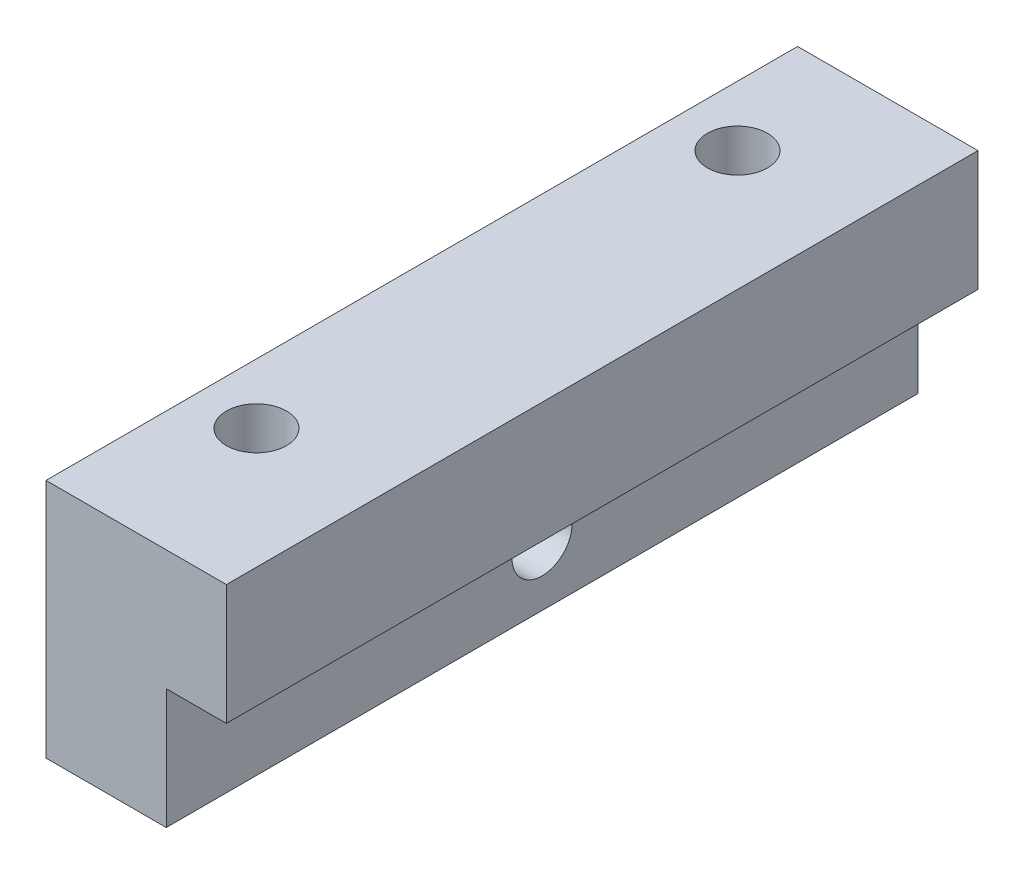
ISO-10303-21;
HEADER;
FILE_DESCRIPTION(('STEP AP214'),'2;1');
FILE_NAME('part.step','',(''),(''),'','','');
FILE_SCHEMA(('AUTOMOTIVE_DESIGN { 1 0 10303 214 1 1 1 1 }'));
ENDSEC;
DATA;
#1=APPLICATION_CONTEXT('core data for automotive mechanical design processes');
#2=APPLICATION_PROTOCOL_DEFINITION('international standard','automotive_design',2000,#1);
#3=PRODUCT_CONTEXT('',#1,'mechanical');
#4=PRODUCT('Part','Part','',(#3));
#5=PRODUCT_RELATED_PRODUCT_CATEGORY('part','',(#4));
#6=PRODUCT_DEFINITION_FORMATION('','',#4);
#7=PRODUCT_DEFINITION_CONTEXT('part definition',#1,'design');
#8=PRODUCT_DEFINITION('design','',#6,#7);
#9=PRODUCT_DEFINITION_SHAPE('','',#8);
#10=(LENGTH_UNIT() NAMED_UNIT(*) SI_UNIT(.MILLI.,.METRE.));
#11=(NAMED_UNIT(*) PLANE_ANGLE_UNIT() SI_UNIT($,.RADIAN.));
#12=(NAMED_UNIT(*) SI_UNIT($,.STERADIAN.) SOLID_ANGLE_UNIT());
#13=UNCERTAINTY_MEASURE_WITH_UNIT(LENGTH_MEASURE(1.E-05),#10,'distance_accuracy_value','');
#14=(GEOMETRIC_REPRESENTATION_CONTEXT(3) GLOBAL_UNCERTAINTY_ASSIGNED_CONTEXT((#13)) GLOBAL_UNIT_ASSIGNED_CONTEXT((#10,
#11,#12)) REPRESENTATION_CONTEXT('',''));
#15=CARTESIAN_POINT('',(0.,0.,0.));
#16=DIRECTION('',(0.,0.,1.));
#17=DIRECTION('',(1.,0.,0.));
#18=AXIS2_PLACEMENT_3D('',#15,#16,#17);
#19=CARTESIAN_POINT('',(8.,0.,25.));
#20=DIRECTION('',(0.,1.,0.));
#21=DIRECTION('',(-1.,0.,0.));
#22=AXIS2_PLACEMENT_3D('',#19,#20,#21);
#23=PLANE('',#22);
#24=CARTESIAN_POINT('',(4.,0.,-17.));
#25=DIRECTION('',(0.,1.,0.));
#26=DIRECTION('',(-1.,0.,0.));
#27=AXIS2_PLACEMENT_3D('',#24,#25,#26);
#28=CIRCLE('',#27,2.);
#29=CARTESIAN_POINT('',(2.,0.,-17.));
#30=VERTEX_POINT('',#29);
#31=EDGE_CURVE('E185',#30,#30,#28,.T.);
#32=ORIENTED_EDGE('',*,*,#31,.T.);
#33=EDGE_LOOP('',(#32));
#34=FACE_BOUND('',#33,.T.);
#35=CARTESIAN_POINT('',(4.00000000000001,0.,15.));
#36=DIRECTION('',(0.,1.,0.));
#37=DIRECTION('',(-1.,0.,0.));
#38=AXIS2_PLACEMENT_3D('',#35,#36,#37);
#39=CIRCLE('',#38,2.);
#40=CARTESIAN_POINT('',(2.,0.,15.));
#41=VERTEX_POINT('',#40);
#42=EDGE_CURVE('E188',#41,#41,#39,.T.);
#43=ORIENTED_EDGE('',*,*,#42,.T.);
#44=EDGE_LOOP('',(#43));
#45=FACE_BOUND('',#44,.T.);
#46=DIRECTION('',(1.,0.,0.));
#47=VECTOR('',#46,1.);
#48=CARTESIAN_POINT('',(8.,0.,-25.));
#49=LINE('',#48,#47);
#50=CARTESIAN_POINT('',(0.,0.,-25.));
#51=VERTEX_POINT('',#50);
#52=CARTESIAN_POINT('',(8.,0.,-25.));
#53=VERTEX_POINT('',#52);
#54=EDGE_CURVE('E128',#51,#53,#49,.T.);
#55=ORIENTED_EDGE('',*,*,#54,.T.);
#56=DIRECTION('',(0.,0.,-1.));
#57=VECTOR('',#56,1.);
#58=CARTESIAN_POINT('',(8.,0.,25.));
#59=LINE('',#58,#57);
#60=CARTESIAN_POINT('',(8.,0.,25.));
#61=VERTEX_POINT('',#60);
#62=EDGE_CURVE('E11',#61,#53,#59,.T.);
#63=ORIENTED_EDGE('',*,*,#62,.F.);
#64=DIRECTION('',(1.,0.,0.));
#65=VECTOR('',#64,1.);
#66=CARTESIAN_POINT('',(8.,0.,25.));
#67=LINE('',#66,#65);
#68=CARTESIAN_POINT('',(0.,0.,25.));
#69=VERTEX_POINT('',#68);
#70=EDGE_CURVE('E145',#69,#61,#67,.T.);
#71=ORIENTED_EDGE('',*,*,#70,.F.);
#72=DIRECTION('',(0.,0.,-1.));
#73=VECTOR('',#72,1.);
#74=CARTESIAN_POINT('',(0.,0.,25.));
#75=LINE('',#74,#73);
#76=EDGE_CURVE('E124',#69,#51,#75,.T.);
#77=ORIENTED_EDGE('',*,*,#76,.T.);
#78=EDGE_LOOP('',(#55,#63,#71,#77));
#79=FACE_BOUND('',#78,.T.);
#80=ADVANCED_FACE('F39',(#34,#45,#79),#23,.F.);
#81=CARTESIAN_POINT('',(8.,8.,25.));
#82=DIRECTION('',(-1.,0.,0.));
#83=DIRECTION('',(0.,-1.,0.));
#84=AXIS2_PLACEMENT_3D('',#81,#82,#83);
#85=PLANE('',#84);
#86=CARTESIAN_POINT('',(8.,4.,0.));
#87=DIRECTION('',(-1.,0.,0.));
#88=DIRECTION('',(0.,-1.,0.));
#89=AXIS2_PLACEMENT_3D('',#86,#87,#88);
#90=CIRCLE('',#89,2.);
#91=CARTESIAN_POINT('',(8.,2.,0.));
#92=VERTEX_POINT('',#91);
#93=EDGE_CURVE('E133',#92,#92,#90,.T.);
#94=ORIENTED_EDGE('',*,*,#93,.T.);
#95=EDGE_LOOP('',(#94));
#96=FACE_BOUND('',#95,.T.);
#97=DIRECTION('',(0.,1.,0.));
#98=VECTOR('',#97,1.);
#99=CARTESIAN_POINT('',(8.,8.,-25.));
#100=LINE('',#99,#98);
#101=CARTESIAN_POINT('',(8.,8.,-25.));
#102=VERTEX_POINT('',#101);
#103=EDGE_CURVE('E132',#53,#102,#100,.T.);
#104=ORIENTED_EDGE('',*,*,#103,.T.);
#105=DIRECTION('',(0.,0.,-1.));
#106=VECTOR('',#105,1.);
#107=CARTESIAN_POINT('',(8.,8.,25.));
#108=LINE('',#107,#106);
#109=CARTESIAN_POINT('',(8.,8.,25.));
#110=VERTEX_POINT('',#109);
#111=EDGE_CURVE('E48',#110,#102,#108,.T.);
#112=ORIENTED_EDGE('',*,*,#111,.F.);
#113=DIRECTION('',(0.,1.,0.));
#114=VECTOR('',#113,1.);
#115=CARTESIAN_POINT('',(8.,8.,25.));
#116=LINE('',#115,#114);
#117=EDGE_CURVE('E93',#61,#110,#116,.T.);
#118=ORIENTED_EDGE('',*,*,#117,.F.);
#119=ORIENTED_EDGE('',*,*,#62,.T.);
#120=EDGE_LOOP('',(#104,#112,#118,#119));
#121=FACE_BOUND('',#120,.T.);
#122=ADVANCED_FACE('F176',(#96,#121),#85,.F.);
#123=CARTESIAN_POINT('',(12.,8.,25.));
#124=DIRECTION('',(0.,1.,0.));
#125=DIRECTION('',(-1.,0.,0.));
#126=AXIS2_PLACEMENT_3D('',#123,#124,#125);
#127=PLANE('',#126);
#128=DIRECTION('',(1.,0.,0.));
#129=VECTOR('',#128,1.);
#130=CARTESIAN_POINT('',(12.,8.,-25.));
#131=LINE('',#130,#129);
#132=CARTESIAN_POINT('',(12.,8.,-25.));
#133=VERTEX_POINT('',#132);
#134=EDGE_CURVE('E136',#102,#133,#131,.T.);
#135=ORIENTED_EDGE('',*,*,#134,.T.);
#136=DIRECTION('',(0.,0.,-1.));
#137=VECTOR('',#136,1.);
#138=CARTESIAN_POINT('',(12.,8.,25.));
#139=LINE('',#138,#137);
#140=CARTESIAN_POINT('',(12.,8.,25.));
#141=VERTEX_POINT('',#140);
#142=EDGE_CURVE('E117',#141,#133,#139,.T.);
#143=ORIENTED_EDGE('',*,*,#142,.F.);
#144=DIRECTION('',(1.,0.,0.));
#145=VECTOR('',#144,1.);
#146=CARTESIAN_POINT('',(12.,8.,25.));
#147=LINE('',#146,#145);
#148=EDGE_CURVE('E106',#110,#141,#147,.T.);
#149=ORIENTED_EDGE('',*,*,#148,.F.);
#150=ORIENTED_EDGE('',*,*,#111,.T.);
#151=EDGE_LOOP('',(#135,#143,#149,#150));
#152=FACE_BOUND('',#151,.T.);
#153=ADVANCED_FACE('F155',(#152),#127,.F.);
#154=CARTESIAN_POINT('',(12.,16.,25.));
#155=DIRECTION('',(-1.,0.,0.));
#156=DIRECTION('',(0.,-1.,0.));
#157=AXIS2_PLACEMENT_3D('',#154,#155,#156);
#158=PLANE('',#157);
#159=DIRECTION('',(0.,1.,0.));
#160=VECTOR('',#159,1.);
#161=CARTESIAN_POINT('',(12.,16.,-25.));
#162=LINE('',#161,#160);
#163=CARTESIAN_POINT('',(12.,16.,-25.));
#164=VERTEX_POINT('',#163);
#165=EDGE_CURVE('E115',#133,#164,#162,.T.);
#166=ORIENTED_EDGE('',*,*,#165,.T.);
#167=DIRECTION('',(0.,0.,-1.));
#168=VECTOR('',#167,1.);
#169=CARTESIAN_POINT('',(12.,16.,25.));
#170=LINE('',#169,#168);
#171=CARTESIAN_POINT('',(12.,16.,25.));
#172=VERTEX_POINT('',#171);
#173=EDGE_CURVE('E112',#172,#164,#170,.T.);
#174=ORIENTED_EDGE('',*,*,#173,.F.);
#175=DIRECTION('',(0.,1.,0.));
#176=VECTOR('',#175,1.);
#177=CARTESIAN_POINT('',(12.,16.,25.));
#178=LINE('',#177,#176);
#179=EDGE_CURVE('E100',#141,#172,#178,.T.);
#180=ORIENTED_EDGE('',*,*,#179,.F.);
#181=ORIENTED_EDGE('',*,*,#142,.T.);
#182=EDGE_LOOP('',(#166,#174,#180,#181));
#183=FACE_BOUND('',#182,.T.);
#184=ADVANCED_FACE('F113',(#183),#158,.F.);
#185=CARTESIAN_POINT('',(0.,16.,25.));
#186=DIRECTION('',(0.,-1.,0.));
#187=DIRECTION('',(0.,0.,-1.));
#188=AXIS2_PLACEMENT_3D('',#185,#186,#187);
#189=PLANE('',#188);
#190=CARTESIAN_POINT('',(4.,16.,-17.));
#191=DIRECTION('',(0.,1.,0.));
#192=DIRECTION('',(0.,0.,1.));
#193=AXIS2_PLACEMENT_3D('',#190,#191,#192);
#194=CIRCLE('',#193,2.);
#195=CARTESIAN_POINT('',(4.,16.,-15.));
#196=VERTEX_POINT('',#195);
#197=EDGE_CURVE('E191',#196,#196,#194,.T.);
#198=ORIENTED_EDGE('',*,*,#197,.F.);
#199=EDGE_LOOP('',(#198));
#200=FACE_BOUND('',#199,.T.);
#201=CARTESIAN_POINT('',(4.00000000000001,16.,15.));
#202=DIRECTION('',(0.,1.,0.));
#203=DIRECTION('',(0.,0.,1.));
#204=AXIS2_PLACEMENT_3D('',#201,#202,#203);
#205=CIRCLE('',#204,2.);
#206=CARTESIAN_POINT('',(4.00000000000001,16.,17.));
#207=VERTEX_POINT('',#206);
#208=EDGE_CURVE('E198',#207,#207,#205,.T.);
#209=ORIENTED_EDGE('',*,*,#208,.F.);
#210=EDGE_LOOP('',(#209));
#211=FACE_BOUND('',#210,.T.);
#212=DIRECTION('',(-1.,0.,0.));
#213=VECTOR('',#212,1.);
#214=CARTESIAN_POINT('',(0.,16.,-25.));
#215=LINE('',#214,#213);
#216=CARTESIAN_POINT('',(0.,16.,-25.));
#217=VERTEX_POINT('',#216);
#218=EDGE_CURVE('E79',#164,#217,#215,.T.);
#219=ORIENTED_EDGE('',*,*,#218,.T.);
#220=DIRECTION('',(0.,0.,-1.));
#221=VECTOR('',#220,1.);
#222=CARTESIAN_POINT('',(0.,16.,25.));
#223=LINE('',#222,#221);
#224=CARTESIAN_POINT('',(0.,16.,25.));
#225=VERTEX_POINT('',#224);
#226=EDGE_CURVE('E118',#225,#217,#223,.T.);
#227=ORIENTED_EDGE('',*,*,#226,.F.);
#228=DIRECTION('',(-1.,0.,0.));
#229=VECTOR('',#228,1.);
#230=CARTESIAN_POINT('',(0.,16.,25.));
#231=LINE('',#230,#229);
#232=EDGE_CURVE('E104',#172,#225,#231,.T.);
#233=ORIENTED_EDGE('',*,*,#232,.F.);
#234=ORIENTED_EDGE('',*,*,#173,.T.);
#235=EDGE_LOOP('',(#219,#227,#233,#234));
#236=FACE_BOUND('',#235,.T.);
#237=ADVANCED_FACE('F120',(#200,#211,#236),#189,.F.);
#238=CARTESIAN_POINT('',(0.,0.,25.));
#239=DIRECTION('',(1.,0.,0.));
#240=DIRECTION('',(0.,0.,-1.));
#241=AXIS2_PLACEMENT_3D('',#238,#239,#240);
#242=PLANE('',#241);
#243=CARTESIAN_POINT('',(0.,4.,0.));
#244=DIRECTION('',(-1.,0.,0.));
#245=DIRECTION('',(0.,0.,1.));
#246=AXIS2_PLACEMENT_3D('',#243,#244,#245);
#247=CIRCLE('',#246,2.);
#248=CARTESIAN_POINT('',(0.,4.,2.));
#249=VERTEX_POINT('',#248);
#250=EDGE_CURVE('E195',#249,#249,#247,.T.);
#251=ORIENTED_EDGE('',*,*,#250,.F.);
#252=EDGE_LOOP('',(#251));
#253=FACE_BOUND('',#252,.T.);
#254=DIRECTION('',(0.,-1.,0.));
#255=VECTOR('',#254,1.);
#256=CARTESIAN_POINT('',(0.,0.,-25.));
#257=LINE('',#256,#255);
#258=EDGE_CURVE('E85',#217,#51,#257,.T.);
#259=ORIENTED_EDGE('',*,*,#258,.T.);
#260=ORIENTED_EDGE('',*,*,#76,.F.);
#261=DIRECTION('',(0.,-1.,0.));
#262=VECTOR('',#261,1.);
#263=CARTESIAN_POINT('',(0.,0.,25.));
#264=LINE('',#263,#262);
#265=EDGE_CURVE('E56',#225,#69,#264,.T.);
#266=ORIENTED_EDGE('',*,*,#265,.F.);
#267=ORIENTED_EDGE('',*,*,#226,.T.);
#268=EDGE_LOOP('',(#259,#260,#266,#267));
#269=FACE_BOUND('',#268,.T.);
#270=ADVANCED_FACE('F162',(#253,#269),#242,.F.);
#271=CARTESIAN_POINT('',(0.,0.,25.));
#272=DIRECTION('',(0.,0.,-1.));
#273=DIRECTION('',(-1.,0.,0.));
#274=AXIS2_PLACEMENT_3D('',#271,#272,#273);
#275=PLANE('',#274);
#276=ORIENTED_EDGE('',*,*,#70,.T.);
#277=ORIENTED_EDGE('',*,*,#117,.T.);
#278=ORIENTED_EDGE('',*,*,#148,.T.);
#279=ORIENTED_EDGE('',*,*,#179,.T.);
#280=ORIENTED_EDGE('',*,*,#232,.T.);
#281=ORIENTED_EDGE('',*,*,#265,.T.);
#282=EDGE_LOOP('',(#276,#277,#278,#279,#280,#281));
#283=FACE_BOUND('',#282,.T.);
#284=ADVANCED_FACE('F102',(#283),#275,.F.);
#285=CARTESIAN_POINT('',(0.,0.,-25.));
#286=DIRECTION('',(0.,0.,-1.));
#287=DIRECTION('',(-1.,0.,0.));
#288=AXIS2_PLACEMENT_3D('',#285,#286,#287);
#289=PLANE('',#288);
#290=ORIENTED_EDGE('',*,*,#54,.F.);
#291=ORIENTED_EDGE('',*,*,#258,.F.);
#292=ORIENTED_EDGE('',*,*,#218,.F.);
#293=ORIENTED_EDGE('',*,*,#165,.F.);
#294=ORIENTED_EDGE('',*,*,#134,.F.);
#295=ORIENTED_EDGE('',*,*,#103,.F.);
#296=EDGE_LOOP('',(#290,#291,#292,#293,#294,#295));
#297=FACE_BOUND('',#296,.T.);
#298=ADVANCED_FACE('F158',(#297),#289,.T.);
#299=CARTESIAN_POINT('',(50.,4.,0.));
#300=DIRECTION('',(-1.,0.,0.));
#301=DIRECTION('',(0.,0.,1.));
#302=AXIS2_PLACEMENT_3D('',#299,#300,#301);
#303=CYLINDRICAL_SURFACE('',#302,2.);
#304=ORIENTED_EDGE('',*,*,#250,.T.);
#305=EDGE_LOOP('',(#304));
#306=FACE_BOUND('',#305,.T.);
#307=ORIENTED_EDGE('',*,*,#93,.F.);
#308=EDGE_LOOP('',(#307));
#309=FACE_BOUND('',#308,.T.);
#310=ADVANCED_FACE('F214',(#306,#309),#303,.F.);
#311=CARTESIAN_POINT('',(4.00000000000001,-34.,15.));
#312=DIRECTION('',(0.,1.,0.));
#313=DIRECTION('',(0.,0.,1.));
#314=AXIS2_PLACEMENT_3D('',#311,#312,#313);
#315=CYLINDRICAL_SURFACE('',#314,2.);
#316=ORIENTED_EDGE('',*,*,#208,.T.);
#317=EDGE_LOOP('',(#316));
#318=FACE_BOUND('',#317,.T.);
#319=ORIENTED_EDGE('',*,*,#42,.F.);
#320=EDGE_LOOP('',(#319));
#321=FACE_BOUND('',#320,.T.);
#322=ADVANCED_FACE('F216',(#318,#321),#315,.F.);
#323=CARTESIAN_POINT('',(4.,-34.,-17.));
#324=DIRECTION('',(0.,1.,0.));
#325=DIRECTION('',(0.,0.,1.));
#326=AXIS2_PLACEMENT_3D('',#323,#324,#325);
#327=CYLINDRICAL_SURFACE('',#326,2.);
#328=ORIENTED_EDGE('',*,*,#197,.T.);
#329=EDGE_LOOP('',(#328));
#330=FACE_BOUND('',#329,.T.);
#331=ORIENTED_EDGE('',*,*,#31,.F.);
#332=EDGE_LOOP('',(#331));
#333=FACE_BOUND('',#332,.T.);
#334=ADVANCED_FACE('F223',(#330,#333),#327,.F.);
#335=CLOSED_SHELL('',(#80,#122,#153,#184,#237,#270,#284,#298,#310,#322,#334));
#336=MANIFOLD_SOLID_BREP('B2',#335);
#337=ADVANCED_BREP_SHAPE_REPRESENTATION('',(#18,#336),#14);
#338=SHAPE_DEFINITION_REPRESENTATION(#9,#337);
ENDSEC;
END-ISO-10303-21;
